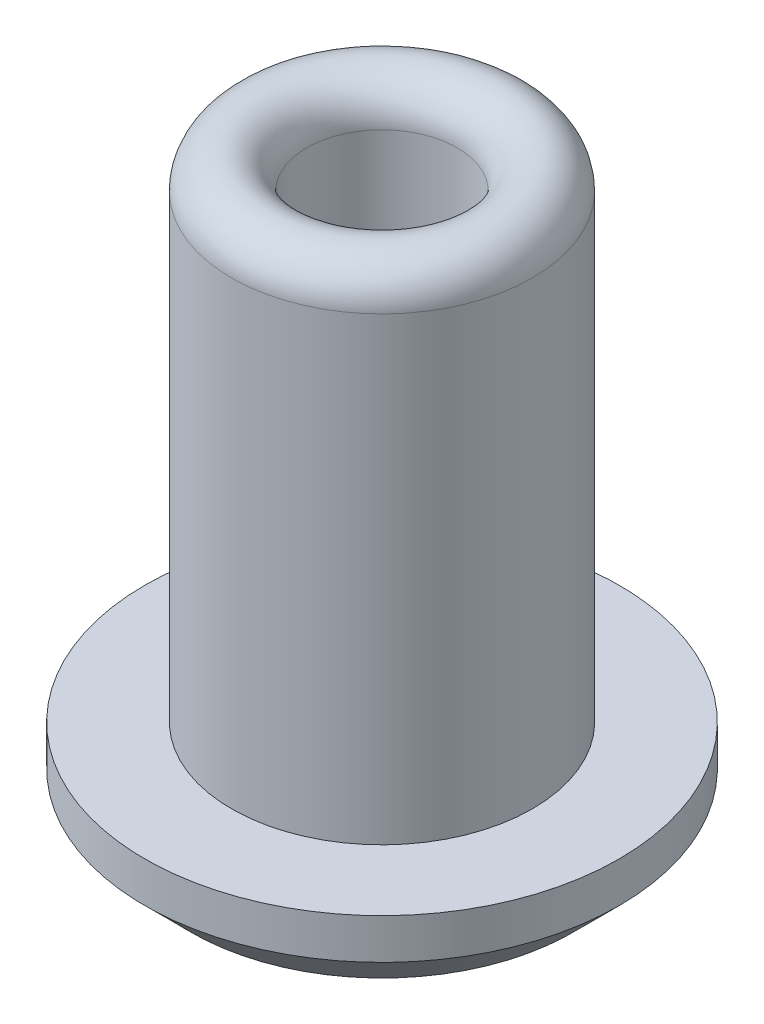
ISO-10303-21;
HEADER;
FILE_DESCRIPTION(('STEP AP214'),'2;1');
FILE_NAME('part.step','',(''),(''),'','','');
FILE_SCHEMA(('AUTOMOTIVE_DESIGN { 1 0 10303 214 1 1 1 1 }'));
ENDSEC;
DATA;
#1=APPLICATION_CONTEXT('core data for automotive mechanical design processes');
#2=APPLICATION_PROTOCOL_DEFINITION('international standard','automotive_design',2000,#1);
#3=PRODUCT_CONTEXT('',#1,'mechanical');
#4=PRODUCT('Part','Part','',(#3));
#5=PRODUCT_RELATED_PRODUCT_CATEGORY('part','',(#4));
#6=PRODUCT_DEFINITION_FORMATION('','',#4);
#7=PRODUCT_DEFINITION_CONTEXT('part definition',#1,'design');
#8=PRODUCT_DEFINITION('design','',#6,#7);
#9=PRODUCT_DEFINITION_SHAPE('','',#8);
#10=(LENGTH_UNIT() NAMED_UNIT(*) SI_UNIT(.MILLI.,.METRE.));
#11=(NAMED_UNIT(*) PLANE_ANGLE_UNIT() SI_UNIT($,.RADIAN.));
#12=(NAMED_UNIT(*) SI_UNIT($,.STERADIAN.) SOLID_ANGLE_UNIT());
#13=UNCERTAINTY_MEASURE_WITH_UNIT(LENGTH_MEASURE(1.E-05),#10,'distance_accuracy_value','');
#14=(GEOMETRIC_REPRESENTATION_CONTEXT(3) GLOBAL_UNCERTAINTY_ASSIGNED_CONTEXT((#13)) GLOBAL_UNIT_ASSIGNED_CONTEXT((#10,
#11,#12)) REPRESENTATION_CONTEXT('',''));
#15=CARTESIAN_POINT('',(0.,0.,0.));
#16=DIRECTION('',(0.,0.,1.));
#17=DIRECTION('',(1.,0.,0.));
#18=AXIS2_PLACEMENT_3D('',#15,#16,#17);
#19=CARTESIAN_POINT('',(-4.1,0.,0.));
#20=DIRECTION('',(0.,1.,0.));
#21=DIRECTION('',(-1.,0.,0.));
#22=AXIS2_PLACEMENT_3D('',#19,#20,#21);
#23=PLANE('',#22);
#24=CARTESIAN_POINT('',(0.,0.,0.));
#25=DIRECTION('',(0.,1.,0.));
#26=DIRECTION('',(-1.,0.,0.));
#27=AXIS2_PLACEMENT_3D('',#24,#25,#26);
#28=CIRCLE('',#27,3.30000000000007);
#29=CARTESIAN_POINT('',(-3.30000000000007,0.,0.));
#30=VERTEX_POINT('',#29);
#31=EDGE_CURVE('E40',#30,#30,#28,.F.);
#32=ORIENTED_EDGE('',*,*,#31,.T.);
#33=EDGE_LOOP('',(#32));
#34=FACE_BOUND('',#33,.T.);
#35=ADVANCED_FACE('F33',(#34),#23,.F.);
#36=CARTESIAN_POINT('',(-0.299999999999999,0.5,0.));
#37=DIRECTION('',(0.,-1.,0.));
#38=DIRECTION('',(1.,0.,0.));
#39=AXIS2_PLACEMENT_3D('',#36,#37,#38);
#40=PLANE('',#39);
#41=CARTESIAN_POINT('',(0.,0.499999999999945,0.));
#42=DIRECTION('',(0.,-1.,0.));
#43=DIRECTION('',(1.,0.,0.));
#44=AXIS2_PLACEMENT_3D('',#41,#42,#43);
#45=CIRCLE('',#44,0.299999999999997);
#46=CARTESIAN_POINT('',(0.299999999999995,0.499999999999946,0.));
#47=VERTEX_POINT('',#46);
#48=EDGE_CURVE('E44',#47,#47,#45,.T.);
#49=ORIENTED_EDGE('',*,*,#48,.F.);
#50=EDGE_LOOP('',(#49));
#51=FACE_BOUND('',#50,.T.);
#52=ADVANCED_FACE('F95',(#51),#40,.F.);
#53=CARTESIAN_POINT('',(0.,1.5,0.));
#54=DIRECTION('',(0.,-1.,0.));
#55=DIRECTION('',(1.,0.,0.));
#56=AXIS2_PLACEMENT_3D('',#53,#54,#55);
#57=DEGENERATE_TOROIDAL_SURFACE('',#56,0.299999999999993,1.,.T.);
#58=CARTESIAN_POINT('',(0.,1.50000000000006,0.));
#59=DIRECTION('',(0.,-1.,0.));
#60=DIRECTION('',(1.,0.,0.));
#61=AXIS2_PLACEMENT_3D('',#58,#59,#60);
#62=CIRCLE('',#61,1.29999999999999);
#63=CARTESIAN_POINT('',(1.29999999999999,1.50000000000006,0.));
#64=VERTEX_POINT('',#63);
#65=EDGE_CURVE('E48',#64,#64,#62,.T.);
#66=ORIENTED_EDGE('',*,*,#65,.F.);
#67=EDGE_LOOP('',(#66));
#68=FACE_BOUND('',#67,.T.);
#69=ORIENTED_EDGE('',*,*,#48,.T.);
#70=EDGE_LOOP('',(#69));
#71=FACE_BOUND('',#70,.T.);
#72=ADVANCED_FACE('F89',(#68,#71),#57,.F.);
#73=CARTESIAN_POINT('',(3.49148133884313E-12,-1000.,0.));
#74=DIRECTION('',(0.,-1.,0.));
#75=DIRECTION('',(1.,0.,0.));
#76=AXIS2_PLACEMENT_3D('',#73,#74,#75);
#77=CYLINDRICAL_SURFACE('',#76,1.29999999999998);
#78=CARTESIAN_POINT('',(0.,9.44999999999996,0.));
#79=DIRECTION('',(0.,-1.,0.));
#80=DIRECTION('',(1.,0.,0.));
#81=AXIS2_PLACEMENT_3D('',#78,#79,#80);
#82=CIRCLE('',#81,1.29999999999997);
#83=CARTESIAN_POINT('',(1.29999999999993,9.44999999999996,0.));
#84=VERTEX_POINT('',#83);
#85=EDGE_CURVE('E53',#84,#84,#82,.T.);
#86=ORIENTED_EDGE('',*,*,#85,.F.);
#87=EDGE_LOOP('',(#86));
#88=FACE_BOUND('',#87,.T.);
#89=ORIENTED_EDGE('',*,*,#65,.T.);
#90=EDGE_LOOP('',(#89));
#91=FACE_BOUND('',#90,.T.);
#92=ADVANCED_FACE('F83',(#88,#91),#77,.F.);
#93=CARTESIAN_POINT('',(0.,9.45,0.));
#94=DIRECTION('',(0.,-1.,0.));
#95=DIRECTION('',(1.,0.,0.));
#96=AXIS2_PLACEMENT_3D('',#93,#94,#95);
#97=TOROIDAL_SURFACE('',#96,1.94999999999997,0.65);
#98=CARTESIAN_POINT('',(0.,9.44999999999996,0.));
#99=DIRECTION('',(0.,-1.,0.));
#100=DIRECTION('',(1.,0.,0.));
#101=AXIS2_PLACEMENT_3D('',#98,#99,#100);
#102=CIRCLE('',#101,2.59999999999997);
#103=CARTESIAN_POINT('',(2.59999999999993,9.44999999999997,0.));
#104=VERTEX_POINT('',#103);
#105=EDGE_CURVE('E56',#104,#104,#102,.T.);
#106=ORIENTED_EDGE('',*,*,#105,.F.);
#107=EDGE_LOOP('',(#106));
#108=FACE_BOUND('',#107,.T.);
#109=ORIENTED_EDGE('',*,*,#85,.T.);
#110=EDGE_LOOP('',(#109));
#111=FACE_BOUND('',#110,.T.);
#112=ADVANCED_FACE('F77',(#108,#111),#97,.T.);
#113=CARTESIAN_POINT('',(3.49148133884313E-12,-1000.,0.));
#114=DIRECTION('',(0.,-1.,0.));
#115=DIRECTION('',(1.,0.,0.));
#116=AXIS2_PLACEMENT_3D('',#113,#114,#115);
#117=CYLINDRICAL_SURFACE('',#116,2.59999999999998);
#118=CARTESIAN_POINT('',(0.,1.50000000000006,0.));
#119=DIRECTION('',(0.,-1.,0.));
#120=DIRECTION('',(1.,0.,0.));
#121=AXIS2_PLACEMENT_3D('',#118,#119,#120);
#122=CIRCLE('',#121,2.59999999999999);
#123=CARTESIAN_POINT('',(2.59999999999999,1.50000000000007,0.));
#124=VERTEX_POINT('',#123);
#125=EDGE_CURVE('E59',#124,#124,#122,.T.);
#126=ORIENTED_EDGE('',*,*,#125,.F.);
#127=EDGE_LOOP('',(#126));
#128=FACE_BOUND('',#127,.T.);
#129=ORIENTED_EDGE('',*,*,#105,.T.);
#130=EDGE_LOOP('',(#129));
#131=FACE_BOUND('',#130,.T.);
#132=ADVANCED_FACE('F71',(#128,#131),#117,.T.);
#133=CARTESIAN_POINT('',(-2.6,1.5,0.));
#134=DIRECTION('',(0.,-1.,0.));
#135=DIRECTION('',(1.,0.,0.));
#136=AXIS2_PLACEMENT_3D('',#133,#134,#135);
#137=PLANE('',#136);
#138=CARTESIAN_POINT('',(0.,1.50000000000006,0.));
#139=DIRECTION('',(0.,-1.,0.));
#140=DIRECTION('',(1.,0.,0.));
#141=AXIS2_PLACEMENT_3D('',#138,#139,#140);
#142=CIRCLE('',#141,4.09999999999999);
#143=CARTESIAN_POINT('',(4.09999999999999,1.50000000000007,0.));
#144=VERTEX_POINT('',#143);
#145=EDGE_CURVE('E62',#144,#144,#142,.T.);
#146=ORIENTED_EDGE('',*,*,#145,.F.);
#147=EDGE_LOOP('',(#146));
#148=FACE_BOUND('',#147,.T.);
#149=ORIENTED_EDGE('',*,*,#125,.T.);
#150=EDGE_LOOP('',(#149));
#151=FACE_BOUND('',#150,.T.);
#152=ADVANCED_FACE('F68',(#148,#151),#137,.F.);
#153=CARTESIAN_POINT('',(3.49148133884313E-12,-1000.,0.));
#154=DIRECTION('',(0.,-1.,0.));
#155=DIRECTION('',(1.,0.,0.));
#156=AXIS2_PLACEMENT_3D('',#153,#154,#155);
#157=CYLINDRICAL_SURFACE('',#156,4.1);
#158=CARTESIAN_POINT('',(0.,0.799999999999912,0.));
#159=DIRECTION('',(0.,1.,0.));
#160=DIRECTION('',(-1.,0.,0.));
#161=AXIS2_PLACEMENT_3D('',#158,#159,#160);
#162=CIRCLE('',#161,4.1);
#163=CARTESIAN_POINT('',(-4.1,0.799999999999897,0.));
#164=VERTEX_POINT('',#163);
#165=EDGE_CURVE('E10',#164,#164,#162,.T.);
#166=ORIENTED_EDGE('',*,*,#165,.T.);
#167=EDGE_LOOP('',(#166));
#168=FACE_BOUND('',#167,.T.);
#169=ORIENTED_EDGE('',*,*,#145,.T.);
#170=EDGE_LOOP('',(#169));
#171=FACE_BOUND('',#170,.T.);
#172=ADVANCED_FACE('F66',(#168,#171),#157,.T.);
#173=CARTESIAN_POINT('',(0.,0.,0.));
#174=DIRECTION('',(0.,1.,0.));
#175=DIRECTION('',(-1.,0.,0.));
#176=AXIS2_PLACEMENT_3D('',#173,#174,#175);
#177=CONICAL_SURFACE('',#176,3.30000000000006,0.785398163397462);
#178=CARTESIAN_POINT('',(-4.1,0.799999999999897,0.));
#179=CARTESIAN_POINT('',(-4.09166666666667,0.791666666666565,0.));
#180=CARTESIAN_POINT('',(-4.08333333333334,0.783333333333233,0.));
#181=CARTESIAN_POINT('',(-4.06666666666667,0.766666666666568,0.));
#182=CARTESIAN_POINT('',(-4.05833333333334,0.758333333333236,0.));
#183=CARTESIAN_POINT('',(-4.04166666666667,0.741666666666571,0.));
#184=CARTESIAN_POINT('',(-4.03333333333334,0.733333333333239,0.));
#185=CARTESIAN_POINT('',(-4.01666666666667,0.716666666666574,0.));
#186=CARTESIAN_POINT('',(-4.00833333333334,0.708333333333242,0.));
#187=CARTESIAN_POINT('',(-3.99166666666668,0.691666666666577,0.));
#188=CARTESIAN_POINT('',(-3.98333333333334,0.683333333333245,0.));
#189=CARTESIAN_POINT('',(-3.96666666666668,0.666666666666581,0.));
#190=CARTESIAN_POINT('',(-3.95833333333335,0.658333333333248,0.));
#191=CARTESIAN_POINT('',(-3.94166666666668,0.641666666666583,0.));
#192=CARTESIAN_POINT('',(-3.93333333333335,0.633333333333251,0.));
#193=CARTESIAN_POINT('',(-3.91666666666668,0.616666666666587,0.));
#194=CARTESIAN_POINT('',(-3.90833333333335,0.608333333333254,0.));
#195=CARTESIAN_POINT('',(-3.89166666666669,0.59166666666659,0.));
#196=CARTESIAN_POINT('',(-3.88333333333335,0.583333333333257,0.));
#197=CARTESIAN_POINT('',(-3.86666666666669,0.566666666666593,0.));
#198=CARTESIAN_POINT('',(-3.85833333333336,0.55833333333326,0.));
#199=CARTESIAN_POINT('',(-3.84166666666669,0.541666666666596,0.));
#200=CARTESIAN_POINT('',(-3.83333333333336,0.533333333333263,0.));
#201=CARTESIAN_POINT('',(-3.81666666666669,0.516666666666599,0.));
#202=CARTESIAN_POINT('',(-3.80833333333336,0.508333333333266,0.));
#203=CARTESIAN_POINT('',(-3.79166666666669,0.491666666666602,0.));
#204=CARTESIAN_POINT('',(-3.78333333333336,0.48333333333327,0.));
#205=CARTESIAN_POINT('',(-3.7666666666667,0.466666666666605,0.));
#206=CARTESIAN_POINT('',(-3.75833333333336,0.458333333333273,0.));
#207=CARTESIAN_POINT('',(-3.7416666666667,0.441666666666608,0.));
#208=CARTESIAN_POINT('',(-3.73333333333337,0.433333333333276,0.));
#209=CARTESIAN_POINT('',(-3.7166666666667,0.416666666666611,0.));
#210=CARTESIAN_POINT('',(-3.70833333333337,0.408333333333279,0.));
#211=CARTESIAN_POINT('',(-3.6916666666667,0.391666666666614,0.));
#212=CARTESIAN_POINT('',(-3.68333333333337,0.383333333333282,0.));
#213=CARTESIAN_POINT('',(-3.66666666666671,0.366666666666617,0.));
#214=CARTESIAN_POINT('',(-3.65833333333337,0.358333333333285,0.));
#215=CARTESIAN_POINT('',(-3.64166666666671,0.34166666666662,0.));
#216=CARTESIAN_POINT('',(-3.63333333333338,0.333333333333288,0.));
#217=CARTESIAN_POINT('',(-3.61666666666671,0.316666666666623,0.));
#218=CARTESIAN_POINT('',(-3.60833333333338,0.308333333333291,0.));
#219=CARTESIAN_POINT('',(-3.59166666666671,0.291666666666626,0.));
#220=CARTESIAN_POINT('',(-3.58333333333338,0.283333333333294,0.));
#221=CARTESIAN_POINT('',(-3.56666666666671,0.266666666666629,0.));
#222=CARTESIAN_POINT('',(-3.55833333333338,0.258333333333297,0.));
#223=CARTESIAN_POINT('',(-3.54166666666672,0.241666666666633,0.));
#224=CARTESIAN_POINT('',(-3.53333333333338,0.2333333333333,0.));
#225=CARTESIAN_POINT('',(-3.51666666666672,0.216666666666636,0.));
#226=CARTESIAN_POINT('',(-3.50833333333339,0.208333333333303,0.));
#227=CARTESIAN_POINT('',(-3.49166666666672,0.191666666666639,0.));
#228=CARTESIAN_POINT('',(-3.48333333333339,0.183333333333307,0.));
#229=CARTESIAN_POINT('',(-3.46666666666672,0.166666666666642,0.));
#230=CARTESIAN_POINT('',(-3.45833333333339,0.15833333333331,0.));
#231=CARTESIAN_POINT('',(-3.44166666666673,0.141666666666645,0.));
#232=CARTESIAN_POINT('',(-3.43333333333339,0.133333333333313,0.));
#233=CARTESIAN_POINT('',(-3.41666666666673,0.116666666666648,0.));
#234=CARTESIAN_POINT('',(-3.40833333333339,0.108333333333316,0.));
#235=CARTESIAN_POINT('',(-3.39166666666673,0.0916666666666511,0.));
#236=CARTESIAN_POINT('',(-3.3833333333334,0.0833333333333187,0.));
#237=CARTESIAN_POINT('',(-3.36666666666673,0.0666666666666541,0.));
#238=CARTESIAN_POINT('',(-3.3583333333334,0.0583333333333219,0.));
#239=CARTESIAN_POINT('',(-3.34166666666673,0.0416666666666572,0.));
#240=CARTESIAN_POINT('',(-3.3333333333334,0.0333333333333249,0.));
#241=CARTESIAN_POINT('',(-3.31666666666674,0.0166666666666602,0.));
#242=CARTESIAN_POINT('',(-3.3083333333334,0.0083333333333279,0.));
#243=CARTESIAN_POINT('',(-3.30000000000007,0.,0.));
#244=B_SPLINE_CURVE_WITH_KNOTS('',3,(#178,#179,#180,#181,#182,#183,#184,#185,#186,#187,#188,
#189,#190,#191,#192,#193,#194,#195,#196,#197,#198,#199,#200,#201,#202,#203,#204,#205,#206,#207,
#208,#209,#210,#211,#212,#213,#214,#215,#216,#217,#218,#219,#220,#221,#222,#223,#224,#225,#226,
#227,#228,#229,#230,#231,#232,#233,#234,#235,#236,#237,#238,#239,#240,#241,#242,#243),
.UNSPECIFIED.,.F.,.F.,(4,2,2,2,2,2,2,2,2,2,2,2,2,2,2,2,2,2,2,2,2,2,2,2,2,2,2,2,2,2,2,2,4),(0.,
0.0353553390593232,0.0707106781186471,0.106066017177971,0.141421356237294,0.176776695296618,
0.212132034355941,0.247487373415265,0.282842712474589,0.318198051533913,0.353553390593237,
0.38890872965256,0.424264068711883,0.459619407771207,0.494974746830531,0.530330085889855,
0.565685424949178,0.601040764008502,0.636396103067825,0.671751442127149,0.707106781186473,
0.742462120245796,0.77781745930512,0.813172798364443,0.848528137423767,0.883883476483091,
0.919238815542414,0.954594154601738,0.989949493661061,1.02530483272038,1.06066017177971,
1.09601551083903,1.13137084989836),.UNSPECIFIED.);
#245=EDGE_CURVE('BSEAM35',#164,#30,#244,.T.);
#246=ORIENTED_EDGE('',*,*,#165,.F.);
#247=ORIENTED_EDGE('',*,*,#31,.F.);
#248=ORIENTED_EDGE('',*,*,#245,.T.);
#249=ORIENTED_EDGE('',*,*,#245,.F.);
#250=EDGE_LOOP('',(#246,#248,#247,#249));
#251=FACE_BOUND('',#250,.T.);
#252=ADVANCED_FACE('F35',(#251),#177,.T.);
#253=CLOSED_SHELL('',(#35,#52,#72,#92,#112,#132,#152,#172,#252));
#254=MANIFOLD_SOLID_BREP('B2',#253);
#255=ADVANCED_BREP_SHAPE_REPRESENTATION('',(#18,#254),#14);
#256=SHAPE_DEFINITION_REPRESENTATION(#9,#255);
ENDSEC;
END-ISO-10303-21;
